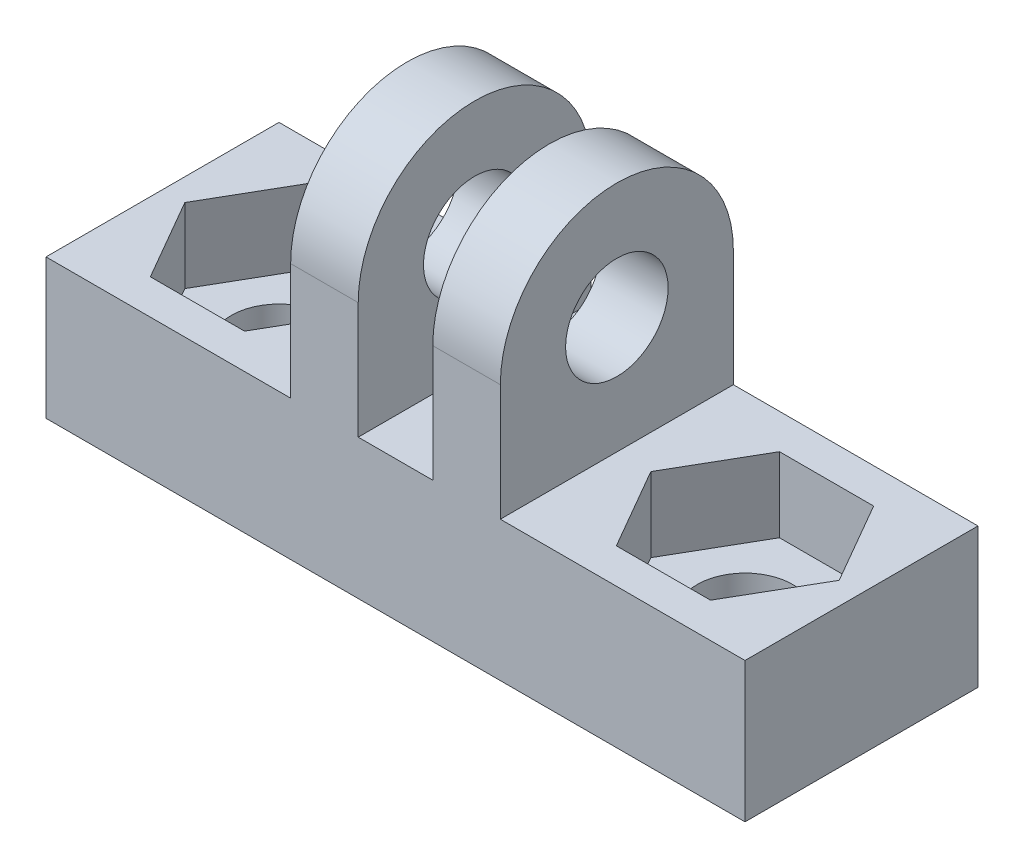
ISO-10303-21;
HEADER;
FILE_DESCRIPTION(('STEP AP214'),'2;1');
FILE_NAME('part.step','',(''),(''),'','','');
FILE_SCHEMA(('AUTOMOTIVE_DESIGN { 1 0 10303 214 1 1 1 1 }'));
ENDSEC;
DATA;
#1=APPLICATION_CONTEXT('core data for automotive mechanical design processes');
#2=APPLICATION_PROTOCOL_DEFINITION('international standard','automotive_design',2000,#1);
#3=PRODUCT_CONTEXT('',#1,'mechanical');
#4=PRODUCT('Part','Part','',(#3));
#5=PRODUCT_RELATED_PRODUCT_CATEGORY('part','',(#4));
#6=PRODUCT_DEFINITION_FORMATION('','',#4);
#7=PRODUCT_DEFINITION_CONTEXT('part definition',#1,'design');
#8=PRODUCT_DEFINITION('design','',#6,#7);
#9=PRODUCT_DEFINITION_SHAPE('','',#8);
#10=(LENGTH_UNIT() NAMED_UNIT(*) SI_UNIT(.MILLI.,.METRE.));
#11=(NAMED_UNIT(*) PLANE_ANGLE_UNIT() SI_UNIT($,.RADIAN.));
#12=(NAMED_UNIT(*) SI_UNIT($,.STERADIAN.) SOLID_ANGLE_UNIT());
#13=UNCERTAINTY_MEASURE_WITH_UNIT(LENGTH_MEASURE(1.E-05),#10,'distance_accuracy_value','');
#14=(GEOMETRIC_REPRESENTATION_CONTEXT(3) GLOBAL_UNCERTAINTY_ASSIGNED_CONTEXT((#13)) GLOBAL_UNIT_ASSIGNED_CONTEXT((#10,
#11,#12)) REPRESENTATION_CONTEXT('',''));
#15=CARTESIAN_POINT('',(0.,0.,0.));
#16=DIRECTION('',(0.,0.,1.));
#17=DIRECTION('',(1.,0.,0.));
#18=AXIS2_PLACEMENT_3D('',#15,#16,#17);
#19=CARTESIAN_POINT('',(5.5,11.,0.));
#20=DIRECTION('',(1.,0.,0.));
#21=DIRECTION('',(0.,0.,-1.));
#22=AXIS2_PLACEMENT_3D('',#19,#20,#21);
#23=CYLINDRICAL_SURFACE('',#22,5.);
#24=CARTESIAN_POINT('',(8.4,11.,0.));
#25=DIRECTION('',(1.,0.,0.));
#26=DIRECTION('',(0.,0.,-1.));
#27=AXIS2_PLACEMENT_3D('',#24,#25,#26);
#28=CIRCLE('',#27,5.);
#29=CARTESIAN_POINT('',(8.4,11.,-5.));
#30=VERTEX_POINT('',#29);
#31=CARTESIAN_POINT('',(8.4,11.,5.));
#32=VERTEX_POINT('',#31);
#33=EDGE_CURVE('E240',#30,#32,#28,.T.);
#34=ORIENTED_EDGE('',*,*,#33,.F.);
#35=DIRECTION('',(1.,0.,0.));
#36=VECTOR('',#35,1.);
#37=CARTESIAN_POINT('',(5.5,11.,-5.));
#38=LINE('',#37,#36);
#39=CARTESIAN_POINT('',(5.5,11.,-5.));
#40=VERTEX_POINT('',#39);
#41=EDGE_CURVE('E281',#40,#30,#38,.T.);
#42=ORIENTED_EDGE('',*,*,#41,.F.);
#43=CARTESIAN_POINT('',(5.5,11.,0.));
#44=DIRECTION('',(-1.,0.,0.));
#45=DIRECTION('',(0.,0.,1.));
#46=AXIS2_PLACEMENT_3D('',#43,#44,#45);
#47=CIRCLE('',#46,5.);
#48=CARTESIAN_POINT('',(5.5,11.,5.));
#49=VERTEX_POINT('',#48);
#50=EDGE_CURVE('E260',#49,#40,#47,.T.);
#51=ORIENTED_EDGE('',*,*,#50,.F.);
#52=DIRECTION('',(1.,0.,0.));
#53=VECTOR('',#52,1.);
#54=CARTESIAN_POINT('',(5.5,11.,5.));
#55=LINE('',#54,#53);
#56=EDGE_CURVE('E285',#49,#32,#55,.T.);
#57=ORIENTED_EDGE('',*,*,#56,.T.);
#58=EDGE_LOOP('',(#34,#42,#51,#57));
#59=FACE_BOUND('',#58,.T.);
#60=ADVANCED_FACE('F43',(#59),#23,.T.);
#61=CARTESIAN_POINT('',(5.5,11.,0.));
#62=DIRECTION('',(1.,0.,0.));
#63=DIRECTION('',(0.,0.,-1.));
#64=AXIS2_PLACEMENT_3D('',#61,#62,#63);
#65=CYLINDRICAL_SURFACE('',#64,2.2);
#66=CARTESIAN_POINT('',(5.5,11.,0.));
#67=DIRECTION('',(-1.,0.,0.));
#68=DIRECTION('',(0.,0.,1.));
#69=AXIS2_PLACEMENT_3D('',#66,#67,#68);
#70=CIRCLE('',#69,2.2);
#71=CARTESIAN_POINT('',(5.5,11.,2.2));
#72=VERTEX_POINT('',#71);
#73=EDGE_CURVE('E246',#72,#72,#70,.T.);
#74=ORIENTED_EDGE('',*,*,#73,.T.);
#75=EDGE_LOOP('',(#74));
#76=FACE_BOUND('',#75,.T.);
#77=CARTESIAN_POINT('',(8.4,11.,0.));
#78=DIRECTION('',(1.,0.,0.));
#79=DIRECTION('',(0.,0.,-1.));
#80=AXIS2_PLACEMENT_3D('',#77,#78,#79);
#81=CIRCLE('',#80,2.2);
#82=CARTESIAN_POINT('',(8.4,11.,-2.2));
#83=VERTEX_POINT('',#82);
#84=EDGE_CURVE('E235',#83,#83,#81,.T.);
#85=ORIENTED_EDGE('',*,*,#84,.T.);
#86=EDGE_LOOP('',(#85));
#87=FACE_BOUND('',#86,.T.);
#88=ADVANCED_FACE('F479',(#76,#87),#65,.F.);
#89=CARTESIAN_POINT('',(0.,6.,0.));
#90=DIRECTION('',(0.,-1.,0.));
#91=DIRECTION('',(0.,0.,-1.));
#92=AXIS2_PLACEMENT_3D('',#89,#90,#91);
#93=PLANE('',#92);
#94=DIRECTION('',(-0.5,0.,-0.866025403784439));
#95=VECTOR('',#94,1.);
#96=CARTESIAN_POINT('',(4.04145188432738,6.,0.));
#97=LINE('',#96,#95);
#98=CARTESIAN_POINT('',(4.04145188432738,6.,0.));
#99=VERTEX_POINT('',#98);
#100=CARTESIAN_POINT('',(2.02072594216369,6.,-3.5));
#101=VERTEX_POINT('',#100);
#102=EDGE_CURVE('E405',#99,#101,#97,.T.);
#103=ORIENTED_EDGE('',*,*,#102,.F.);
#104=DIRECTION('',(0.5,0.,-0.866025403784439));
#105=VECTOR('',#104,1.);
#106=CARTESIAN_POINT('',(2.02072594216369,6.,3.5));
#107=LINE('',#106,#105);
#108=CARTESIAN_POINT('',(2.02072594216369,6.,3.5));
#109=VERTEX_POINT('',#108);
#110=EDGE_CURVE('E376',#109,#99,#107,.T.);
#111=ORIENTED_EDGE('',*,*,#110,.F.);
#112=DIRECTION('',(1.,0.,0.));
#113=VECTOR('',#112,1.);
#114=CARTESIAN_POINT('',(-2.02072594216369,6.,3.5));
#115=LINE('',#114,#113);
#116=CARTESIAN_POINT('',(-2.02072594216369,6.,3.5));
#117=VERTEX_POINT('',#116);
#118=EDGE_CURVE('E382',#117,#109,#115,.T.);
#119=ORIENTED_EDGE('',*,*,#118,.F.);
#120=DIRECTION('',(0.5,0.,0.866025403784439));
#121=VECTOR('',#120,1.);
#122=CARTESIAN_POINT('',(-4.04145188432738,6.,0.));
#123=LINE('',#122,#121);
#124=CARTESIAN_POINT('',(-4.04145188432738,6.,0.));
#125=VERTEX_POINT('',#124);
#126=EDGE_CURVE('E417',#125,#117,#123,.T.);
#127=ORIENTED_EDGE('',*,*,#126,.F.);
#128=DIRECTION('',(-0.5,0.,0.866025403784439));
#129=VECTOR('',#128,1.);
#130=CARTESIAN_POINT('',(-2.02072594216369,6.,-3.5));
#131=LINE('',#130,#129);
#132=CARTESIAN_POINT('',(-2.02072594216369,6.,-3.5));
#133=VERTEX_POINT('',#132);
#134=EDGE_CURVE('E413',#133,#125,#131,.T.);
#135=ORIENTED_EDGE('',*,*,#134,.F.);
#136=DIRECTION('',(-1.,0.,0.));
#137=VECTOR('',#136,1.);
#138=CARTESIAN_POINT('',(2.02072594216369,6.,-3.5));
#139=LINE('',#138,#137);
#140=EDGE_CURVE('E409',#101,#133,#139,.T.);
#141=ORIENTED_EDGE('',*,*,#140,.F.);
#142=EDGE_LOOP('',(#103,#111,#119,#127,#135,#141));
#143=FACE_BOUND('',#142,.T.);
#144=DIRECTION('',(0.,0.,1.));
#145=VECTOR('',#144,1.);
#146=CARTESIAN_POINT('',(5.5,6.,5.));
#147=LINE('',#146,#145);
#148=CARTESIAN_POINT('',(5.5,6.,-5.));
#149=VERTEX_POINT('',#148);
#150=CARTESIAN_POINT('',(5.5,6.,5.));
#151=VERTEX_POINT('',#150);
#152=EDGE_CURVE('E69',#149,#151,#147,.T.);
#153=ORIENTED_EDGE('',*,*,#152,.F.);
#154=DIRECTION('',(-1.,0.,0.));
#155=VECTOR('',#154,1.);
#156=CARTESIAN_POINT('',(-5.,6.,-5.));
#157=LINE('',#156,#155);
#158=CARTESIAN_POINT('',(-5.,6.,-5.));
#159=VERTEX_POINT('',#158);
#160=EDGE_CURVE('E452',#149,#159,#157,.T.);
#161=ORIENTED_EDGE('',*,*,#160,.T.);
#162=DIRECTION('',(0.,0.,1.));
#163=VECTOR('',#162,1.);
#164=CARTESIAN_POINT('',(-5.,6.,5.));
#165=LINE('',#164,#163);
#166=CARTESIAN_POINT('',(-5.,6.,5.));
#167=VERTEX_POINT('',#166);
#168=EDGE_CURVE('E451',#159,#167,#165,.T.);
#169=ORIENTED_EDGE('',*,*,#168,.T.);
#170=DIRECTION('',(1.,0.,0.));
#171=VECTOR('',#170,1.);
#172=CARTESIAN_POINT('',(-5.,6.,5.));
#173=LINE('',#172,#171);
#174=EDGE_CURVE('E456',#167,#151,#173,.T.);
#175=ORIENTED_EDGE('',*,*,#174,.T.);
#176=EDGE_LOOP('',(#153,#161,#169,#175));
#177=FACE_BOUND('',#176,.T.);
#178=ADVANCED_FACE('F502',(#143,#177),#93,.F.);
#179=CARTESIAN_POINT('',(20.,0.,0.));
#180=DIRECTION('',(0.,1.,0.));
#181=DIRECTION('',(0.,0.,1.));
#182=AXIS2_PLACEMENT_3D('',#179,#180,#181);
#183=CYLINDRICAL_SURFACE('',#182,2.05);
#184=CARTESIAN_POINT('',(20.,0.,0.));
#185=DIRECTION('',(0.,1.,0.));
#186=DIRECTION('',(0.,0.,1.));
#187=AXIS2_PLACEMENT_3D('',#184,#185,#186);
#188=CIRCLE('',#187,2.05);
#189=CARTESIAN_POINT('',(20.,0.,2.05));
#190=VERTEX_POINT('',#189);
#191=EDGE_CURVE('E356',#190,#190,#188,.T.);
#192=ORIENTED_EDGE('',*,*,#191,.F.);
#193=EDGE_LOOP('',(#192));
#194=FACE_BOUND('',#193,.T.);
#195=CARTESIAN_POINT('',(20.,2.8,0.));
#196=DIRECTION('',(0.,1.,0.));
#197=DIRECTION('',(0.,0.,1.));
#198=AXIS2_PLACEMENT_3D('',#195,#196,#197);
#199=CIRCLE('',#198,2.05);
#200=CARTESIAN_POINT('',(20.,2.8,2.05));
#201=VERTEX_POINT('',#200);
#202=EDGE_CURVE('E340',#201,#201,#199,.F.);
#203=ORIENTED_EDGE('',*,*,#202,.F.);
#204=EDGE_LOOP('',(#203));
#205=FACE_BOUND('',#204,.T.);
#206=ADVANCED_FACE('F583',(#194,#205),#183,.F.);
#207=CARTESIAN_POINT('',(0.,6.,0.));
#208=DIRECTION('',(0.,-1.,0.));
#209=DIRECTION('',(0.,0.,-1.));
#210=AXIS2_PLACEMENT_3D('',#207,#208,#209);
#211=CYLINDRICAL_SURFACE('',#210,2.05);
#212=CARTESIAN_POINT('',(0.,0.,0.));
#213=DIRECTION('',(0.,1.,0.));
#214=DIRECTION('',(0.,0.,1.));
#215=AXIS2_PLACEMENT_3D('',#212,#213,#214);
#216=CIRCLE('',#215,2.05);
#217=CARTESIAN_POINT('',(0.,0.,2.05));
#218=VERTEX_POINT('',#217);
#219=EDGE_CURVE('E443',#218,#218,#216,.T.);
#220=ORIENTED_EDGE('',*,*,#219,.F.);
#221=EDGE_LOOP('',(#220));
#222=FACE_BOUND('',#221,.T.);
#223=CARTESIAN_POINT('',(0.,2.8,0.));
#224=DIRECTION('',(0.,1.,0.));
#225=DIRECTION('',(0.,0.,1.));
#226=AXIS2_PLACEMENT_3D('',#223,#224,#225);
#227=CIRCLE('',#226,2.05);
#228=CARTESIAN_POINT('',(0.,2.8,2.05));
#229=VERTEX_POINT('',#228);
#230=EDGE_CURVE('E427',#229,#229,#227,.T.);
#231=ORIENTED_EDGE('',*,*,#230,.T.);
#232=EDGE_LOOP('',(#231));
#233=FACE_BOUND('',#232,.T.);
#234=ADVANCED_FACE('F586',(#222,#233),#211,.F.);
#235=DIRECTION('',(-0.5,0.,-0.866025403784439));
#236=VECTOR('',#235,1.);
#237=CARTESIAN_POINT('',(24.0414518843274,6.,0.));
#238=LINE('',#237,#236);
#239=CARTESIAN_POINT('',(24.0414518843274,6.,0.));
#240=VERTEX_POINT('',#239);
#241=CARTESIAN_POINT('',(22.0207259421637,6.,-3.5));
#242=VERTEX_POINT('',#241);
#243=EDGE_CURVE('E318',#240,#242,#238,.T.);
#244=ORIENTED_EDGE('',*,*,#243,.F.);
#245=DIRECTION('',(0.499999999999999,0.,-0.866025403784439));
#246=VECTOR('',#245,1.);
#247=CARTESIAN_POINT('',(22.0207259421637,6.,3.5));
#248=LINE('',#247,#246);
#249=CARTESIAN_POINT('',(22.0207259421637,6.,3.5));
#250=VERTEX_POINT('',#249);
#251=EDGE_CURVE('E289',#250,#240,#248,.T.);
#252=ORIENTED_EDGE('',*,*,#251,.F.);
#253=DIRECTION('',(1.,0.,0.));
#254=VECTOR('',#253,1.);
#255=CARTESIAN_POINT('',(17.9792740578363,6.,3.5));
#256=LINE('',#255,#254);
#257=CARTESIAN_POINT('',(17.9792740578363,6.,3.5));
#258=VERTEX_POINT('',#257);
#259=EDGE_CURVE('E295',#258,#250,#256,.T.);
#260=ORIENTED_EDGE('',*,*,#259,.F.);
#261=DIRECTION('',(0.5,0.,0.866025403784439));
#262=VECTOR('',#261,1.);
#263=CARTESIAN_POINT('',(15.9585481156726,6.,0.));
#264=LINE('',#263,#262);
#265=CARTESIAN_POINT('',(15.9585481156726,6.,0.));
#266=VERTEX_POINT('',#265);
#267=EDGE_CURVE('E330',#266,#258,#264,.T.);
#268=ORIENTED_EDGE('',*,*,#267,.F.);
#269=DIRECTION('',(-0.5,0.,0.866025403784439));
#270=VECTOR('',#269,1.);
#271=CARTESIAN_POINT('',(17.9792740578363,6.,-3.5));
#272=LINE('',#271,#270);
#273=CARTESIAN_POINT('',(17.9792740578363,6.,-3.5));
#274=VERTEX_POINT('',#273);
#275=EDGE_CURVE('E326',#274,#266,#272,.T.);
#276=ORIENTED_EDGE('',*,*,#275,.F.);
#277=DIRECTION('',(-1.,0.,0.));
#278=VECTOR('',#277,1.);
#279=CARTESIAN_POINT('',(22.0207259421637,6.,-3.5));
#280=LINE('',#279,#278);
#281=EDGE_CURVE('E322',#242,#274,#280,.T.);
#282=ORIENTED_EDGE('',*,*,#281,.F.);
#283=EDGE_LOOP('',(#244,#252,#260,#268,#276,#282));
#284=FACE_BOUND('',#283,.T.);
#285=CARTESIAN_POINT('',(25.,6.,-5.));
#286=VERTEX_POINT('',#285);
#287=CARTESIAN_POINT('',(14.5,6.,-5.));
#288=VERTEX_POINT('',#287);
#289=EDGE_CURVE('E448',#286,#288,#157,.T.);
#290=ORIENTED_EDGE('',*,*,#289,.T.);
#291=DIRECTION('',(0.,0.,1.));
#292=VECTOR('',#291,1.);
#293=CARTESIAN_POINT('',(14.5,6.,5.));
#294=LINE('',#293,#292);
#295=CARTESIAN_POINT('',(14.5,6.,5.));
#296=VERTEX_POINT('',#295);
#297=EDGE_CURVE('E250',#288,#296,#294,.T.);
#298=ORIENTED_EDGE('',*,*,#297,.T.);
#299=CARTESIAN_POINT('',(25.,6.,5.));
#300=VERTEX_POINT('',#299);
#301=EDGE_CURVE('E455',#296,#300,#173,.T.);
#302=ORIENTED_EDGE('',*,*,#301,.T.);
#303=DIRECTION('',(0.,0.,1.));
#304=VECTOR('',#303,1.);
#305=CARTESIAN_POINT('',(25.,6.,5.));
#306=LINE('',#305,#304);
#307=EDGE_CURVE('E372',#286,#300,#306,.T.);
#308=ORIENTED_EDGE('',*,*,#307,.F.);
#309=EDGE_LOOP('',(#290,#298,#302,#308));
#310=FACE_BOUND('',#309,.T.);
#311=ADVANCED_FACE('F520',(#284,#310),#93,.F.);
#312=CARTESIAN_POINT('',(0.,0.,0.));
#313=DIRECTION('',(0.,-1.,0.));
#314=DIRECTION('',(0.,0.,-1.));
#315=AXIS2_PLACEMENT_3D('',#312,#313,#314);
#316=PLANE('',#315);
#317=ORIENTED_EDGE('',*,*,#191,.T.);
#318=EDGE_LOOP('',(#317));
#319=FACE_BOUND('',#318,.T.);
#320=DIRECTION('',(-1.,0.,0.));
#321=VECTOR('',#320,1.);
#322=CARTESIAN_POINT('',(-5.,0.,-5.));
#323=LINE('',#322,#321);
#324=CARTESIAN_POINT('',(25.,0.,-5.));
#325=VERTEX_POINT('',#324);
#326=CARTESIAN_POINT('',(-5.,0.,-5.));
#327=VERTEX_POINT('',#326);
#328=EDGE_CURVE('E447',#325,#327,#323,.T.);
#329=ORIENTED_EDGE('',*,*,#328,.F.);
#330=DIRECTION('',(0.,0.,-1.));
#331=VECTOR('',#330,1.);
#332=CARTESIAN_POINT('',(25.,0.,5.));
#333=LINE('',#332,#331);
#334=CARTESIAN_POINT('',(25.,0.,5.));
#335=VERTEX_POINT('',#334);
#336=EDGE_CURVE('E364',#335,#325,#333,.T.);
#337=ORIENTED_EDGE('',*,*,#336,.F.);
#338=DIRECTION('',(1.,0.,0.));
#339=VECTOR('',#338,1.);
#340=CARTESIAN_POINT('',(-5.,0.,5.));
#341=LINE('',#340,#339);
#342=CARTESIAN_POINT('',(-5.,0.,5.));
#343=VERTEX_POINT('',#342);
#344=EDGE_CURVE('E464',#343,#335,#341,.T.);
#345=ORIENTED_EDGE('',*,*,#344,.F.);
#346=DIRECTION('',(0.,0.,1.));
#347=VECTOR('',#346,1.);
#348=CARTESIAN_POINT('',(-5.,0.,5.));
#349=LINE('',#348,#347);
#350=EDGE_CURVE('E461',#327,#343,#349,.T.);
#351=ORIENTED_EDGE('',*,*,#350,.F.);
#352=EDGE_LOOP('',(#329,#337,#345,#351));
#353=FACE_BOUND('',#352,.T.);
#354=ORIENTED_EDGE('',*,*,#219,.T.);
#355=EDGE_LOOP('',(#354));
#356=FACE_BOUND('',#355,.T.);
#357=ADVANCED_FACE('F509',(#319,#353,#356),#316,.T.);
#358=CARTESIAN_POINT('',(-5.,6.,-5.));
#359=DIRECTION('',(0.,0.,1.));
#360=DIRECTION('',(1.,0.,0.));
#361=AXIS2_PLACEMENT_3D('',#358,#359,#360);
#362=PLANE('',#361);
#363=DIRECTION('',(-1.,0.,0.));
#364=VECTOR('',#363,1.);
#365=CARTESIAN_POINT('',(11.6,6.,-5.));
#366=LINE('',#365,#364);
#367=CARTESIAN_POINT('',(11.6,6.,-5.));
#368=VERTEX_POINT('',#367);
#369=CARTESIAN_POINT('',(8.4,6.,-5.));
#370=VERTEX_POINT('',#369);
#371=EDGE_CURVE('E224',#368,#370,#366,.T.);
#372=ORIENTED_EDGE('',*,*,#371,.F.);
#373=DIRECTION('',(0.,-1.,0.));
#374=VECTOR('',#373,1.);
#375=CARTESIAN_POINT('',(11.6,6.,-5.));
#376=LINE('',#375,#374);
#377=CARTESIAN_POINT('',(11.6,11.,-5.));
#378=VERTEX_POINT('',#377);
#379=EDGE_CURVE('E208',#378,#368,#376,.T.);
#380=ORIENTED_EDGE('',*,*,#379,.F.);
#381=CARTESIAN_POINT('',(14.5,11.,-5.));
#382=VERTEX_POINT('',#381);
#383=EDGE_CURVE('E267',#378,#382,#38,.T.);
#384=ORIENTED_EDGE('',*,*,#383,.T.);
#385=DIRECTION('',(0.,-1.,0.));
#386=VECTOR('',#385,1.);
#387=CARTESIAN_POINT('',(14.5,6.,-5.));
#388=LINE('',#387,#386);
#389=EDGE_CURVE('E257',#382,#288,#388,.T.);
#390=ORIENTED_EDGE('',*,*,#389,.T.);
#391=ORIENTED_EDGE('',*,*,#289,.F.);
#392=DIRECTION('',(0.,1.,0.));
#393=VECTOR('',#392,1.);
#394=CARTESIAN_POINT('',(25.,6.,-5.));
#395=LINE('',#394,#393);
#396=EDGE_CURVE('E368',#325,#286,#395,.T.);
#397=ORIENTED_EDGE('',*,*,#396,.F.);
#398=ORIENTED_EDGE('',*,*,#328,.T.);
#399=DIRECTION('',(0.,-1.,0.));
#400=VECTOR('',#399,1.);
#401=CARTESIAN_POINT('',(-5.,6.,-5.));
#402=LINE('',#401,#400);
#403=EDGE_CURVE('E11',#159,#327,#402,.T.);
#404=ORIENTED_EDGE('',*,*,#403,.F.);
#405=ORIENTED_EDGE('',*,*,#160,.F.);
#406=DIRECTION('',(0.,-1.,0.));
#407=VECTOR('',#406,1.);
#408=CARTESIAN_POINT('',(5.5,6.,-5.));
#409=LINE('',#408,#407);
#410=EDGE_CURVE('E263',#40,#149,#409,.T.);
#411=ORIENTED_EDGE('',*,*,#410,.F.);
#412=ORIENTED_EDGE('',*,*,#41,.T.);
#413=DIRECTION('',(0.,-1.,0.));
#414=VECTOR('',#413,1.);
#415=CARTESIAN_POINT('',(8.4,6.,-5.));
#416=LINE('',#415,#414);
#417=EDGE_CURVE('E61',#30,#370,#416,.T.);
#418=ORIENTED_EDGE('',*,*,#417,.T.);
#419=EDGE_LOOP('',(#372,#380,#384,#390,#391,#397,#398,#404,#405,#411,#412,#418));
#420=FACE_BOUND('',#419,.T.);
#421=ADVANCED_FACE('F45',(#420),#362,.F.);
#422=CARTESIAN_POINT('',(-5.,6.,5.));
#423=DIRECTION('',(1.,0.,0.));
#424=DIRECTION('',(0.,0.,-1.));
#425=AXIS2_PLACEMENT_3D('',#422,#423,#424);
#426=PLANE('',#425);
#427=ORIENTED_EDGE('',*,*,#350,.T.);
#428=DIRECTION('',(0.,-1.,0.));
#429=VECTOR('',#428,1.);
#430=CARTESIAN_POINT('',(-5.,6.,5.));
#431=LINE('',#430,#429);
#432=EDGE_CURVE('E53',#167,#343,#431,.T.);
#433=ORIENTED_EDGE('',*,*,#432,.F.);
#434=ORIENTED_EDGE('',*,*,#168,.F.);
#435=ORIENTED_EDGE('',*,*,#403,.T.);
#436=EDGE_LOOP('',(#427,#433,#434,#435));
#437=FACE_BOUND('',#436,.T.);
#438=ADVANCED_FACE('F506',(#437),#426,.F.);
#439=CARTESIAN_POINT('',(-5.,6.,5.));
#440=DIRECTION('',(0.,0.,-1.));
#441=DIRECTION('',(-1.,0.,0.));
#442=AXIS2_PLACEMENT_3D('',#439,#440,#441);
#443=PLANE('',#442);
#444=CARTESIAN_POINT('',(11.6,11.,5.));
#445=VERTEX_POINT('',#444);
#446=CARTESIAN_POINT('',(14.5,11.,5.));
#447=VERTEX_POINT('',#446);
#448=EDGE_CURVE('E284',#445,#447,#55,.T.);
#449=ORIENTED_EDGE('',*,*,#448,.F.);
#450=DIRECTION('',(0.,1.,0.));
#451=VECTOR('',#450,1.);
#452=CARTESIAN_POINT('',(11.6,6.,5.));
#453=LINE('',#452,#451);
#454=CARTESIAN_POINT('',(11.6,6.,5.));
#455=VERTEX_POINT('',#454);
#456=EDGE_CURVE('E228',#455,#445,#453,.T.);
#457=ORIENTED_EDGE('',*,*,#456,.F.);
#458=DIRECTION('',(-1.,0.,0.));
#459=VECTOR('',#458,1.);
#460=CARTESIAN_POINT('',(11.6,6.,5.));
#461=LINE('',#460,#459);
#462=CARTESIAN_POINT('',(8.4,6.,5.));
#463=VERTEX_POINT('',#462);
#464=EDGE_CURVE('E226',#455,#463,#461,.T.);
#465=ORIENTED_EDGE('',*,*,#464,.T.);
#466=DIRECTION('',(0.,1.,0.));
#467=VECTOR('',#466,1.);
#468=CARTESIAN_POINT('',(8.4,6.,5.));
#469=LINE('',#468,#467);
#470=EDGE_CURVE('E219',#463,#32,#469,.T.);
#471=ORIENTED_EDGE('',*,*,#470,.T.);
#472=ORIENTED_EDGE('',*,*,#56,.F.);
#473=DIRECTION('',(0.,1.,0.));
#474=VECTOR('',#473,1.);
#475=CARTESIAN_POINT('',(5.5,6.,5.));
#476=LINE('',#475,#474);
#477=EDGE_CURVE('E256',#151,#49,#476,.T.);
#478=ORIENTED_EDGE('',*,*,#477,.F.);
#479=ORIENTED_EDGE('',*,*,#174,.F.);
#480=ORIENTED_EDGE('',*,*,#432,.T.);
#481=ORIENTED_EDGE('',*,*,#344,.T.);
#482=DIRECTION('',(0.,-1.,0.));
#483=VECTOR('',#482,1.);
#484=CARTESIAN_POINT('',(25.,6.,5.));
#485=LINE('',#484,#483);
#486=EDGE_CURVE('E360',#300,#335,#485,.T.);
#487=ORIENTED_EDGE('',*,*,#486,.F.);
#488=ORIENTED_EDGE('',*,*,#301,.F.);
#489=DIRECTION('',(0.,1.,0.));
#490=VECTOR('',#489,1.);
#491=CARTESIAN_POINT('',(14.5,6.,5.));
#492=LINE('',#491,#490);
#493=EDGE_CURVE('E270',#296,#447,#492,.T.);
#494=ORIENTED_EDGE('',*,*,#493,.T.);
#495=EDGE_LOOP('',(#449,#457,#465,#471,#472,#478,#479,#480,#481,#487,#488,#494));
#496=FACE_BOUND('',#495,.T.);
#497=ADVANCED_FACE('F490',(#496),#443,.F.);
#498=CARTESIAN_POINT('',(2.02072594216369,2.8,3.5));
#499=DIRECTION('',(0.866025403784439,0.,0.5));
#500=DIRECTION('',(0.5,0.,-0.866025403784439));
#501=AXIS2_PLACEMENT_3D('',#498,#499,#500);
#502=PLANE('',#501);
#503=ORIENTED_EDGE('',*,*,#110,.T.);
#504=DIRECTION('',(0.,1.,0.));
#505=VECTOR('',#504,1.);
#506=CARTESIAN_POINT('',(4.04145188432738,2.8,0.));
#507=LINE('',#506,#505);
#508=CARTESIAN_POINT('',(4.04145188432738,2.8,0.));
#509=VERTEX_POINT('',#508);
#510=EDGE_CURVE('E402',#509,#99,#507,.T.);
#511=ORIENTED_EDGE('',*,*,#510,.F.);
#512=DIRECTION('',(0.5,0.,-0.866025403784439));
#513=VECTOR('',#512,1.);
#514=CARTESIAN_POINT('',(2.02072594216369,2.8,3.5));
#515=LINE('',#514,#513);
#516=CARTESIAN_POINT('',(2.02072594216369,2.8,3.5));
#517=VERTEX_POINT('',#516);
#518=EDGE_CURVE('E377',#517,#509,#515,.T.);
#519=ORIENTED_EDGE('',*,*,#518,.F.);
#520=DIRECTION('',(0.,1.,0.));
#521=VECTOR('',#520,1.);
#522=CARTESIAN_POINT('',(2.02072594216369,2.8,3.5));
#523=LINE('',#522,#521);
#524=EDGE_CURVE('E424',#517,#109,#523,.T.);
#525=ORIENTED_EDGE('',*,*,#524,.T.);
#526=EDGE_LOOP('',(#503,#511,#519,#525));
#527=FACE_BOUND('',#526,.T.);
#528=ADVANCED_FACE('F599',(#527),#502,.F.);
#529=CARTESIAN_POINT('',(-2.02072594216369,2.8,3.5));
#530=DIRECTION('',(0.,0.,1.));
#531=DIRECTION('',(1.,0.,0.));
#532=AXIS2_PLACEMENT_3D('',#529,#530,#531);
#533=PLANE('',#532);
#534=ORIENTED_EDGE('',*,*,#118,.T.);
#535=ORIENTED_EDGE('',*,*,#524,.F.);
#536=DIRECTION('',(1.,0.,0.));
#537=VECTOR('',#536,1.);
#538=CARTESIAN_POINT('',(-2.02072594216369,2.8,3.5));
#539=LINE('',#538,#537);
#540=CARTESIAN_POINT('',(-2.02072594216369,2.8,3.5));
#541=VERTEX_POINT('',#540);
#542=EDGE_CURVE('E398',#541,#517,#539,.T.);
#543=ORIENTED_EDGE('',*,*,#542,.F.);
#544=DIRECTION('',(0.,1.,0.));
#545=VECTOR('',#544,1.);
#546=CARTESIAN_POINT('',(-2.02072594216369,2.8,3.5));
#547=LINE('',#546,#545);
#548=EDGE_CURVE('E428',#541,#117,#547,.T.);
#549=ORIENTED_EDGE('',*,*,#548,.T.);
#550=EDGE_LOOP('',(#534,#535,#543,#549));
#551=FACE_BOUND('',#550,.T.);
#552=ADVANCED_FACE('F595',(#551),#533,.F.);
#553=CARTESIAN_POINT('',(-4.04145188432738,2.8,0.));
#554=DIRECTION('',(-0.866025403784439,0.,0.5));
#555=DIRECTION('',(0.5,0.,0.866025403784439));
#556=AXIS2_PLACEMENT_3D('',#553,#554,#555);
#557=PLANE('',#556);
#558=ORIENTED_EDGE('',*,*,#126,.T.);
#559=ORIENTED_EDGE('',*,*,#548,.F.);
#560=DIRECTION('',(0.5,0.,0.866025403784439));
#561=VECTOR('',#560,1.);
#562=CARTESIAN_POINT('',(-4.04145188432738,2.8,0.));
#563=LINE('',#562,#561);
#564=CARTESIAN_POINT('',(-4.04145188432738,2.8,0.));
#565=VERTEX_POINT('',#564);
#566=EDGE_CURVE('E394',#565,#541,#563,.T.);
#567=ORIENTED_EDGE('',*,*,#566,.F.);
#568=DIRECTION('',(0.,1.,0.));
#569=VECTOR('',#568,1.);
#570=CARTESIAN_POINT('',(-4.04145188432738,2.8,0.));
#571=LINE('',#570,#569);
#572=EDGE_CURVE('E431',#565,#125,#571,.T.);
#573=ORIENTED_EDGE('',*,*,#572,.T.);
#574=EDGE_LOOP('',(#558,#559,#567,#573));
#575=FACE_BOUND('',#574,.T.);
#576=ADVANCED_FACE('F598',(#575),#557,.F.);
#577=CARTESIAN_POINT('',(-2.02072594216369,2.8,-3.5));
#578=DIRECTION('',(-0.866025403784439,0.,-0.5));
#579=DIRECTION('',(-0.5,0.,0.866025403784439));
#580=AXIS2_PLACEMENT_3D('',#577,#578,#579);
#581=PLANE('',#580);
#582=ORIENTED_EDGE('',*,*,#134,.T.);
#583=ORIENTED_EDGE('',*,*,#572,.F.);
#584=DIRECTION('',(-0.5,0.,0.866025403784439));
#585=VECTOR('',#584,1.);
#586=CARTESIAN_POINT('',(-2.02072594216369,2.8,-3.5));
#587=LINE('',#586,#585);
#588=CARTESIAN_POINT('',(-2.02072594216369,2.8,-3.5));
#589=VERTEX_POINT('',#588);
#590=EDGE_CURVE('E390',#589,#565,#587,.T.);
#591=ORIENTED_EDGE('',*,*,#590,.F.);
#592=DIRECTION('',(0.,1.,0.));
#593=VECTOR('',#592,1.);
#594=CARTESIAN_POINT('',(-2.02072594216369,2.8,-3.5));
#595=LINE('',#594,#593);
#596=EDGE_CURVE('E434',#589,#133,#595,.T.);
#597=ORIENTED_EDGE('',*,*,#596,.T.);
#598=EDGE_LOOP('',(#582,#583,#591,#597));
#599=FACE_BOUND('',#598,.T.);
#600=ADVANCED_FACE('F603',(#599),#581,.F.);
#601=CARTESIAN_POINT('',(2.02072594216369,2.8,-3.5));
#602=DIRECTION('',(0.,0.,-1.));
#603=DIRECTION('',(-1.,0.,0.));
#604=AXIS2_PLACEMENT_3D('',#601,#602,#603);
#605=PLANE('',#604);
#606=ORIENTED_EDGE('',*,*,#140,.T.);
#607=ORIENTED_EDGE('',*,*,#596,.F.);
#608=DIRECTION('',(-1.,0.,0.));
#609=VECTOR('',#608,1.);
#610=CARTESIAN_POINT('',(2.02072594216369,2.8,-3.5));
#611=LINE('',#610,#609);
#612=CARTESIAN_POINT('',(2.02072594216369,2.8,-3.5));
#613=VERTEX_POINT('',#612);
#614=EDGE_CURVE('E386',#613,#589,#611,.T.);
#615=ORIENTED_EDGE('',*,*,#614,.F.);
#616=DIRECTION('',(0.,1.,0.));
#617=VECTOR('',#616,1.);
#618=CARTESIAN_POINT('',(2.02072594216369,2.8,-3.5));
#619=LINE('',#618,#617);
#620=EDGE_CURVE('E437',#613,#101,#619,.T.);
#621=ORIENTED_EDGE('',*,*,#620,.T.);
#622=EDGE_LOOP('',(#606,#607,#615,#621));
#623=FACE_BOUND('',#622,.T.);
#624=ADVANCED_FACE('F607',(#623),#605,.F.);
#625=CARTESIAN_POINT('',(4.04145188432738,2.8,0.));
#626=DIRECTION('',(0.866025403784439,0.,-0.5));
#627=DIRECTION('',(-0.5,0.,-0.866025403784439));
#628=AXIS2_PLACEMENT_3D('',#625,#626,#627);
#629=PLANE('',#628);
#630=ORIENTED_EDGE('',*,*,#102,.T.);
#631=ORIENTED_EDGE('',*,*,#620,.F.);
#632=DIRECTION('',(-0.5,0.,-0.866025403784439));
#633=VECTOR('',#632,1.);
#634=CARTESIAN_POINT('',(4.04145188432738,2.8,0.));
#635=LINE('',#634,#633);
#636=EDGE_CURVE('E381',#509,#613,#635,.T.);
#637=ORIENTED_EDGE('',*,*,#636,.F.);
#638=ORIENTED_EDGE('',*,*,#510,.T.);
#639=EDGE_LOOP('',(#630,#631,#637,#638));
#640=FACE_BOUND('',#639,.T.);
#641=ADVANCED_FACE('F593',(#640),#629,.F.);
#642=CARTESIAN_POINT('',(0.,2.8,0.));
#643=DIRECTION('',(0.,1.,0.));
#644=DIRECTION('',(0.,0.,1.));
#645=AXIS2_PLACEMENT_3D('',#642,#643,#644);
#646=PLANE('',#645);
#647=ORIENTED_EDGE('',*,*,#230,.F.);
#648=EDGE_LOOP('',(#647));
#649=FACE_BOUND('',#648,.T.);
#650=ORIENTED_EDGE('',*,*,#518,.T.);
#651=ORIENTED_EDGE('',*,*,#636,.T.);
#652=ORIENTED_EDGE('',*,*,#614,.T.);
#653=ORIENTED_EDGE('',*,*,#590,.T.);
#654=ORIENTED_EDGE('',*,*,#566,.T.);
#655=ORIENTED_EDGE('',*,*,#542,.T.);
#656=EDGE_LOOP('',(#650,#651,#652,#653,#654,#655));
#657=FACE_BOUND('',#656,.T.);
#658=ADVANCED_FACE('F590',(#649,#657),#646,.T.);
#659=CARTESIAN_POINT('',(25.,0.,0.));
#660=DIRECTION('',(1.,0.,0.));
#661=DIRECTION('',(0.,0.,-1.));
#662=AXIS2_PLACEMENT_3D('',#659,#660,#661);
#663=PLANE('',#662);
#664=ORIENTED_EDGE('',*,*,#486,.T.);
#665=ORIENTED_EDGE('',*,*,#336,.T.);
#666=ORIENTED_EDGE('',*,*,#396,.T.);
#667=ORIENTED_EDGE('',*,*,#307,.T.);
#668=EDGE_LOOP('',(#664,#665,#666,#667));
#669=FACE_BOUND('',#668,.T.);
#670=ADVANCED_FACE('F516',(#669),#663,.T.);
#671=CARTESIAN_POINT('',(0.,2.8,0.));
#672=DIRECTION('',(0.,1.,0.));
#673=DIRECTION('',(0.,0.,1.));
#674=AXIS2_PLACEMENT_3D('',#671,#672,#673);
#675=PLANE('',#674);
#676=DIRECTION('',(0.499999999999999,0.,-0.866025403784439));
#677=VECTOR('',#676,1.);
#678=CARTESIAN_POINT('',(22.0207259421637,2.8,3.5));
#679=LINE('',#678,#677);
#680=CARTESIAN_POINT('',(22.0207259421637,2.8,3.5));
#681=VERTEX_POINT('',#680);
#682=CARTESIAN_POINT('',(24.0414518843274,2.8,0.));
#683=VERTEX_POINT('',#682);
#684=EDGE_CURVE('E290',#681,#683,#679,.T.);
#685=ORIENTED_EDGE('',*,*,#684,.T.);
#686=DIRECTION('',(-0.5,0.,-0.866025403784439));
#687=VECTOR('',#686,1.);
#688=CARTESIAN_POINT('',(24.0414518843274,2.8,0.));
#689=LINE('',#688,#687);
#690=CARTESIAN_POINT('',(22.0207259421637,2.8,-3.5));
#691=VERTEX_POINT('',#690);
#692=EDGE_CURVE('E294',#683,#691,#689,.T.);
#693=ORIENTED_EDGE('',*,*,#692,.T.);
#694=DIRECTION('',(-1.,0.,0.));
#695=VECTOR('',#694,1.);
#696=CARTESIAN_POINT('',(22.0207259421637,2.8,-3.5));
#697=LINE('',#696,#695);
#698=CARTESIAN_POINT('',(17.9792740578363,2.8,-3.5));
#699=VERTEX_POINT('',#698);
#700=EDGE_CURVE('E299',#691,#699,#697,.T.);
#701=ORIENTED_EDGE('',*,*,#700,.T.);
#702=DIRECTION('',(-0.5,0.,0.866025403784439));
#703=VECTOR('',#702,1.);
#704=CARTESIAN_POINT('',(17.9792740578363,2.8,-3.5));
#705=LINE('',#704,#703);
#706=CARTESIAN_POINT('',(15.9585481156726,2.8,0.));
#707=VERTEX_POINT('',#706);
#708=EDGE_CURVE('E303',#699,#707,#705,.T.);
#709=ORIENTED_EDGE('',*,*,#708,.T.);
#710=DIRECTION('',(0.5,0.,0.866025403784439));
#711=VECTOR('',#710,1.);
#712=CARTESIAN_POINT('',(15.9585481156726,2.8,0.));
#713=LINE('',#712,#711);
#714=CARTESIAN_POINT('',(17.9792740578363,2.8,3.5));
#715=VERTEX_POINT('',#714);
#716=EDGE_CURVE('E307',#707,#715,#713,.T.);
#717=ORIENTED_EDGE('',*,*,#716,.T.);
#718=DIRECTION('',(1.,0.,0.));
#719=VECTOR('',#718,1.);
#720=CARTESIAN_POINT('',(17.9792740578363,2.8,3.5));
#721=LINE('',#720,#719);
#722=EDGE_CURVE('E311',#715,#681,#721,.T.);
#723=ORIENTED_EDGE('',*,*,#722,.T.);
#724=EDGE_LOOP('',(#685,#693,#701,#709,#717,#723));
#725=FACE_BOUND('',#724,.T.);
#726=ORIENTED_EDGE('',*,*,#202,.T.);
#727=EDGE_LOOP('',(#726));
#728=FACE_BOUND('',#727,.T.);
#729=ADVANCED_FACE('F556',(#725,#728),#675,.T.);
#730=CARTESIAN_POINT('',(22.0207259421637,2.8,3.5));
#731=DIRECTION('',(0.866025403784439,0.,0.499999999999999));
#732=DIRECTION('',(0.499999999999999,0.,-0.866025403784439));
#733=AXIS2_PLACEMENT_3D('',#730,#731,#732);
#734=PLANE('',#733);
#735=ORIENTED_EDGE('',*,*,#251,.T.);
#736=DIRECTION('',(0.,1.,0.));
#737=VECTOR('',#736,1.);
#738=CARTESIAN_POINT('',(24.0414518843274,2.8,0.));
#739=LINE('',#738,#737);
#740=EDGE_CURVE('E315',#683,#240,#739,.T.);
#741=ORIENTED_EDGE('',*,*,#740,.F.);
#742=ORIENTED_EDGE('',*,*,#684,.F.);
#743=DIRECTION('',(0.,1.,0.));
#744=VECTOR('',#743,1.);
#745=CARTESIAN_POINT('',(22.0207259421637,2.8,3.5));
#746=LINE('',#745,#744);
#747=EDGE_CURVE('E337',#681,#250,#746,.T.);
#748=ORIENTED_EDGE('',*,*,#747,.T.);
#749=EDGE_LOOP('',(#735,#741,#742,#748));
#750=FACE_BOUND('',#749,.T.);
#751=ADVANCED_FACE('F559',(#750),#734,.F.);
#752=CARTESIAN_POINT('',(17.9792740578363,2.8,3.5));
#753=DIRECTION('',(0.,0.,1.));
#754=DIRECTION('',(1.,0.,0.));
#755=AXIS2_PLACEMENT_3D('',#752,#753,#754);
#756=PLANE('',#755);
#757=ORIENTED_EDGE('',*,*,#259,.T.);
#758=ORIENTED_EDGE('',*,*,#747,.F.);
#759=ORIENTED_EDGE('',*,*,#722,.F.);
#760=DIRECTION('',(0.,1.,0.));
#761=VECTOR('',#760,1.);
#762=CARTESIAN_POINT('',(17.9792740578363,2.8,3.5));
#763=LINE('',#762,#761);
#764=EDGE_CURVE('E341',#715,#258,#763,.T.);
#765=ORIENTED_EDGE('',*,*,#764,.T.);
#766=EDGE_LOOP('',(#757,#758,#759,#765));
#767=FACE_BOUND('',#766,.T.);
#768=ADVANCED_FACE('F561',(#767),#756,.F.);
#769=CARTESIAN_POINT('',(15.9585481156726,2.8,0.));
#770=DIRECTION('',(-0.866025403784439,0.,0.5));
#771=DIRECTION('',(0.5,0.,0.866025403784439));
#772=AXIS2_PLACEMENT_3D('',#769,#770,#771);
#773=PLANE('',#772);
#774=ORIENTED_EDGE('',*,*,#267,.T.);
#775=ORIENTED_EDGE('',*,*,#764,.F.);
#776=ORIENTED_EDGE('',*,*,#716,.F.);
#777=DIRECTION('',(0.,1.,0.));
#778=VECTOR('',#777,1.);
#779=CARTESIAN_POINT('',(15.9585481156726,2.8,0.));
#780=LINE('',#779,#778);
#781=EDGE_CURVE('E344',#707,#266,#780,.T.);
#782=ORIENTED_EDGE('',*,*,#781,.T.);
#783=EDGE_LOOP('',(#774,#775,#776,#782));
#784=FACE_BOUND('',#783,.T.);
#785=ADVANCED_FACE('F564',(#784),#773,.F.);
#786=CARTESIAN_POINT('',(17.9792740578363,2.8,-3.5));
#787=DIRECTION('',(-0.866025403784439,0.,-0.5));
#788=DIRECTION('',(-0.5,0.,0.866025403784439));
#789=AXIS2_PLACEMENT_3D('',#786,#787,#788);
#790=PLANE('',#789);
#791=ORIENTED_EDGE('',*,*,#275,.T.);
#792=ORIENTED_EDGE('',*,*,#781,.F.);
#793=ORIENTED_EDGE('',*,*,#708,.F.);
#794=DIRECTION('',(0.,1.,0.));
#795=VECTOR('',#794,1.);
#796=CARTESIAN_POINT('',(17.9792740578363,2.8,-3.5));
#797=LINE('',#796,#795);
#798=EDGE_CURVE('E347',#699,#274,#797,.T.);
#799=ORIENTED_EDGE('',*,*,#798,.T.);
#800=EDGE_LOOP('',(#791,#792,#793,#799));
#801=FACE_BOUND('',#800,.T.);
#802=ADVANCED_FACE('F568',(#801),#790,.F.);
#803=CARTESIAN_POINT('',(22.0207259421637,2.8,-3.5));
#804=DIRECTION('',(0.,0.,-1.));
#805=DIRECTION('',(-1.,0.,0.));
#806=AXIS2_PLACEMENT_3D('',#803,#804,#805);
#807=PLANE('',#806);
#808=ORIENTED_EDGE('',*,*,#281,.T.);
#809=ORIENTED_EDGE('',*,*,#798,.F.);
#810=ORIENTED_EDGE('',*,*,#700,.F.);
#811=DIRECTION('',(0.,1.,0.));
#812=VECTOR('',#811,1.);
#813=CARTESIAN_POINT('',(22.0207259421637,2.8,-3.5));
#814=LINE('',#813,#812);
#815=EDGE_CURVE('E350',#691,#242,#814,.T.);
#816=ORIENTED_EDGE('',*,*,#815,.T.);
#817=EDGE_LOOP('',(#808,#809,#810,#816));
#818=FACE_BOUND('',#817,.T.);
#819=ADVANCED_FACE('F572',(#818),#807,.F.);
#820=CARTESIAN_POINT('',(24.0414518843274,2.8,0.));
#821=DIRECTION('',(0.866025403784439,0.,-0.5));
#822=DIRECTION('',(-0.5,0.,-0.866025403784439));
#823=AXIS2_PLACEMENT_3D('',#820,#821,#822);
#824=PLANE('',#823);
#825=ORIENTED_EDGE('',*,*,#243,.T.);
#826=ORIENTED_EDGE('',*,*,#815,.F.);
#827=ORIENTED_EDGE('',*,*,#692,.F.);
#828=ORIENTED_EDGE('',*,*,#740,.T.);
#829=EDGE_LOOP('',(#825,#826,#827,#828));
#830=FACE_BOUND('',#829,.T.);
#831=ADVANCED_FACE('F548',(#830),#824,.F.);
#832=CARTESIAN_POINT('',(5.5,11.,0.));
#833=DIRECTION('',(-1.,0.,0.));
#834=DIRECTION('',(0.,0.,1.));
#835=AXIS2_PLACEMENT_3D('',#832,#833,#834);
#836=PLANE('',#835);
#837=ORIENTED_EDGE('',*,*,#152,.T.);
#838=ORIENTED_EDGE('',*,*,#477,.T.);
#839=ORIENTED_EDGE('',*,*,#50,.T.);
#840=ORIENTED_EDGE('',*,*,#410,.T.);
#841=EDGE_LOOP('',(#837,#838,#839,#840));
#842=FACE_BOUND('',#841,.T.);
#843=ORIENTED_EDGE('',*,*,#73,.F.);
#844=EDGE_LOOP('',(#843));
#845=FACE_BOUND('',#844,.T.);
#846=ADVANCED_FACE('F497',(#842,#845),#836,.T.);
#847=CARTESIAN_POINT('',(14.5,11.,0.));
#848=DIRECTION('',(-1.,0.,0.));
#849=DIRECTION('',(0.,0.,1.));
#850=AXIS2_PLACEMENT_3D('',#847,#848,#849);
#851=PLANE('',#850);
#852=ORIENTED_EDGE('',*,*,#297,.F.);
#853=ORIENTED_EDGE('',*,*,#389,.F.);
#854=CARTESIAN_POINT('',(14.5,11.,0.));
#855=DIRECTION('',(-1.,0.,0.));
#856=DIRECTION('',(0.,0.,1.));
#857=AXIS2_PLACEMENT_3D('',#854,#855,#856);
#858=CIRCLE('',#857,5.);
#859=EDGE_CURVE('E274',#447,#382,#858,.T.);
#860=ORIENTED_EDGE('',*,*,#859,.F.);
#861=ORIENTED_EDGE('',*,*,#493,.F.);
#862=EDGE_LOOP('',(#852,#853,#860,#861));
#863=FACE_BOUND('',#862,.T.);
#864=CARTESIAN_POINT('',(14.5,11.,0.));
#865=DIRECTION('',(-1.,0.,0.));
#866=DIRECTION('',(0.,0.,1.));
#867=AXIS2_PLACEMENT_3D('',#864,#865,#866);
#868=CIRCLE('',#867,2.2);
#869=CARTESIAN_POINT('',(14.5,11.,2.2));
#870=VERTEX_POINT('',#869);
#871=EDGE_CURVE('E245',#870,#870,#868,.T.);
#872=ORIENTED_EDGE('',*,*,#871,.T.);
#873=EDGE_LOOP('',(#872));
#874=FACE_BOUND('',#873,.T.);
#875=ADVANCED_FACE('F538',(#863,#874),#851,.F.);
#876=ORIENTED_EDGE('',*,*,#383,.F.);
#877=CARTESIAN_POINT('',(11.6,11.,0.));
#878=DIRECTION('',(1.,0.,0.));
#879=DIRECTION('',(0.,0.,-1.));
#880=AXIS2_PLACEMENT_3D('',#877,#878,#879);
#881=CIRCLE('',#880,5.);
#882=EDGE_CURVE('E214',#378,#445,#881,.T.);
#883=ORIENTED_EDGE('',*,*,#882,.T.);
#884=ORIENTED_EDGE('',*,*,#448,.T.);
#885=ORIENTED_EDGE('',*,*,#859,.T.);
#886=EDGE_LOOP('',(#876,#883,#884,#885));
#887=FACE_BOUND('',#886,.T.);
#888=ADVANCED_FACE('F534',(#887),#23,.T.);
#889=CARTESIAN_POINT('',(11.6,11.,0.));
#890=DIRECTION('',(1.,0.,0.));
#891=DIRECTION('',(0.,0.,-1.));
#892=AXIS2_PLACEMENT_3D('',#889,#890,#891);
#893=CIRCLE('',#892,2.2);
#894=CARTESIAN_POINT('',(11.6,11.,-2.2));
#895=VERTEX_POINT('',#894);
#896=EDGE_CURVE('E47',#895,#895,#893,.T.);
#897=ORIENTED_EDGE('',*,*,#896,.F.);
#898=EDGE_LOOP('',(#897));
#899=FACE_BOUND('',#898,.T.);
#900=ORIENTED_EDGE('',*,*,#871,.F.);
#901=EDGE_LOOP('',(#900));
#902=FACE_BOUND('',#901,.T.);
#903=ADVANCED_FACE('F531',(#899,#902),#65,.F.);
#904=CARTESIAN_POINT('',(11.6,0.,0.));
#905=DIRECTION('',(1.,0.,0.));
#906=DIRECTION('',(0.,0.,-1.));
#907=AXIS2_PLACEMENT_3D('',#904,#905,#906);
#908=PLANE('',#907);
#909=ORIENTED_EDGE('',*,*,#896,.T.);
#910=EDGE_LOOP('',(#909));
#911=FACE_BOUND('',#910,.T.);
#912=ORIENTED_EDGE('',*,*,#379,.T.);
#913=DIRECTION('',(0.,0.,1.));
#914=VECTOR('',#913,1.);
#915=CARTESIAN_POINT('',(11.6,6.,-5.));
#916=LINE('',#915,#914);
#917=EDGE_CURVE('E211',#368,#455,#916,.T.);
#918=ORIENTED_EDGE('',*,*,#917,.T.);
#919=ORIENTED_EDGE('',*,*,#456,.T.);
#920=ORIENTED_EDGE('',*,*,#882,.F.);
#921=EDGE_LOOP('',(#912,#918,#919,#920));
#922=FACE_BOUND('',#921,.T.);
#923=ADVANCED_FACE('F210',(#911,#922),#908,.F.);
#924=CARTESIAN_POINT('',(8.4,0.,0.));
#925=DIRECTION('',(1.,0.,0.));
#926=DIRECTION('',(0.,0.,-1.));
#927=AXIS2_PLACEMENT_3D('',#924,#925,#926);
#928=PLANE('',#927);
#929=ORIENTED_EDGE('',*,*,#84,.F.);
#930=EDGE_LOOP('',(#929));
#931=FACE_BOUND('',#930,.T.);
#932=ORIENTED_EDGE('',*,*,#33,.T.);
#933=ORIENTED_EDGE('',*,*,#470,.F.);
#934=DIRECTION('',(0.,0.,1.));
#935=VECTOR('',#934,1.);
#936=CARTESIAN_POINT('',(8.4,6.,-5.));
#937=LINE('',#936,#935);
#938=EDGE_CURVE('E494',#370,#463,#937,.T.);
#939=ORIENTED_EDGE('',*,*,#938,.F.);
#940=ORIENTED_EDGE('',*,*,#417,.F.);
#941=EDGE_LOOP('',(#932,#933,#939,#940));
#942=FACE_BOUND('',#941,.T.);
#943=ADVANCED_FACE('F481',(#931,#942),#928,.T.);
#944=CARTESIAN_POINT('',(11.6,6.,-5.));
#945=DIRECTION('',(0.,-1.,0.));
#946=DIRECTION('',(0.,0.,-1.));
#947=AXIS2_PLACEMENT_3D('',#944,#945,#946);
#948=PLANE('',#947);
#949=ORIENTED_EDGE('',*,*,#938,.T.);
#950=ORIENTED_EDGE('',*,*,#464,.F.);
#951=ORIENTED_EDGE('',*,*,#917,.F.);
#952=ORIENTED_EDGE('',*,*,#371,.T.);
#953=EDGE_LOOP('',(#949,#950,#951,#952));
#954=FACE_BOUND('',#953,.T.);
#955=ADVANCED_FACE('F223',(#954),#948,.F.);
#956=CLOSED_SHELL('',(#60,#88,#178,#206,#234,#311,#357,#421,#438,#497,#528,#552,#576,#600,#624,
#641,#658,#670,#729,#751,#768,#785,#802,#819,#831,#846,#875,#888,#903,#923,#943,#955));
#957=MANIFOLD_SOLID_BREP('B2',#956);
#958=ADVANCED_BREP_SHAPE_REPRESENTATION('',(#18,#957),#14);
#959=SHAPE_DEFINITION_REPRESENTATION(#9,#958);
ENDSEC;
END-ISO-10303-21;
